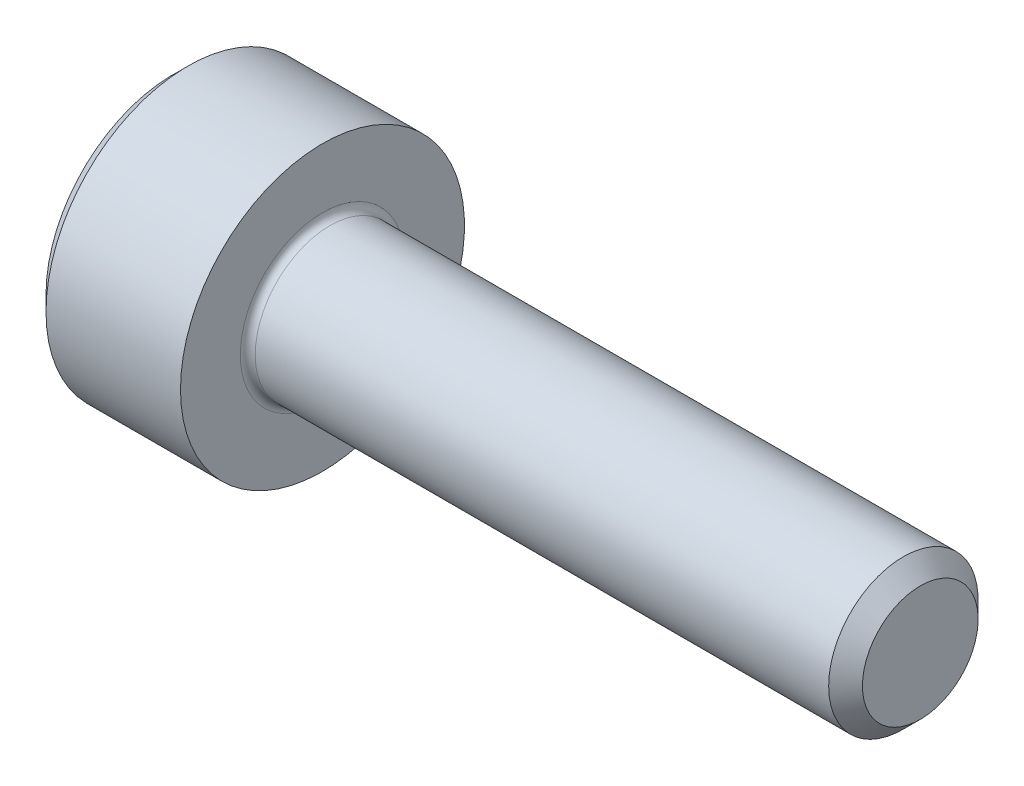
ISO-10303-21;
HEADER;
FILE_DESCRIPTION(('STEP AP214'),'2;1');
FILE_NAME('part.step','',(''),(''),'','','');
FILE_SCHEMA(('AUTOMOTIVE_DESIGN { 1 0 10303 214 1 1 1 1 }'));
ENDSEC;
DATA;
#1=APPLICATION_CONTEXT('core data for automotive mechanical design processes');
#2=APPLICATION_PROTOCOL_DEFINITION('international standard','automotive_design',2000,#1);
#3=PRODUCT_CONTEXT('',#1,'mechanical');
#4=PRODUCT('Part','Part','',(#3));
#5=PRODUCT_RELATED_PRODUCT_CATEGORY('part','',(#4));
#6=PRODUCT_DEFINITION_FORMATION('','',#4);
#7=PRODUCT_DEFINITION_CONTEXT('part definition',#1,'design');
#8=PRODUCT_DEFINITION('design','',#6,#7);
#9=PRODUCT_DEFINITION_SHAPE('','',#8);
#10=(LENGTH_UNIT() NAMED_UNIT(*) SI_UNIT(.MILLI.,.METRE.));
#11=(NAMED_UNIT(*) PLANE_ANGLE_UNIT() SI_UNIT($,.RADIAN.));
#12=(NAMED_UNIT(*) SI_UNIT($,.STERADIAN.) SOLID_ANGLE_UNIT());
#13=UNCERTAINTY_MEASURE_WITH_UNIT(LENGTH_MEASURE(1.E-05),#10,'distance_accuracy_value','');
#14=(GEOMETRIC_REPRESENTATION_CONTEXT(3) GLOBAL_UNCERTAINTY_ASSIGNED_CONTEXT((#13)) GLOBAL_UNIT_ASSIGNED_CONTEXT((#10,
#11,#12)) REPRESENTATION_CONTEXT('',''));
#15=CARTESIAN_POINT('',(0.,0.,0.));
#16=DIRECTION('',(0.,0.,1.));
#17=DIRECTION('',(1.,0.,0.));
#18=AXIS2_PLACEMENT_3D('',#15,#16,#17);
#19=CARTESIAN_POINT('',(0.,0.,0.));
#20=DIRECTION('',(-1.,0.,0.));
#21=DIRECTION('',(0.,0.,1.));
#22=AXIS2_PLACEMENT_3D('',#19,#20,#21);
#23=PLANE('',#22);
#24=DIRECTION('',(0.,-0.499999999999999,0.866025403784439));
#25=VECTOR('',#24,1.);
#26=CARTESIAN_POINT('',(0.,0.892006165897969,0.));
#27=LINE('',#26,#25);
#28=CARTESIAN_POINT('',(0.,0.892006165897969,0.));
#29=VERTEX_POINT('',#28);
#30=CARTESIAN_POINT('',(0.,0.446003082948983,0.772499999999997));
#31=VERTEX_POINT('',#30);
#32=EDGE_CURVE('E261',#29,#31,#27,.T.);
#33=ORIENTED_EDGE('',*,*,#32,.T.);
#34=DIRECTION('',(0.,1.,0.));
#35=VECTOR('',#34,1.);
#36=CARTESIAN_POINT('',(0.,-0.446003082948989,0.772499999999998));
#37=LINE('',#36,#35);
#38=CARTESIAN_POINT('',(0.,-0.446003082948989,0.772499999999998));
#39=VERTEX_POINT('',#38);
#40=EDGE_CURVE('E132',#39,#31,#37,.T.);
#41=ORIENTED_EDGE('',*,*,#40,.F.);
#42=DIRECTION('',(0.,-0.500000000000001,-0.866025403784438));
#43=VECTOR('',#42,1.);
#44=CARTESIAN_POINT('',(0.,-0.446003082948989,0.772499999999998));
#45=LINE('',#44,#43);
#46=CARTESIAN_POINT('',(0.,-0.892006165897975,0.));
#47=VERTEX_POINT('',#46);
#48=EDGE_CURVE('E264',#39,#47,#45,.T.);
#49=ORIENTED_EDGE('',*,*,#48,.T.);
#50=DIRECTION('',(0.,0.499999999999999,-0.866025403784439));
#51=VECTOR('',#50,1.);
#52=CARTESIAN_POINT('',(0.,-0.892006165897975,0.));
#53=LINE('',#52,#51);
#54=CARTESIAN_POINT('',(0.,-0.44600308294899,-0.772500000000001));
#55=VERTEX_POINT('',#54);
#56=EDGE_CURVE('E267',#47,#55,#53,.T.);
#57=ORIENTED_EDGE('',*,*,#56,.T.);
#58=DIRECTION('',(0.,-1.,0.));
#59=VECTOR('',#58,1.);
#60=CARTESIAN_POINT('',(0.,0.446003082948982,-0.772500000000003));
#61=LINE('',#60,#59);
#62=CARTESIAN_POINT('',(0.,0.446003082948982,-0.772500000000003));
#63=VERTEX_POINT('',#62);
#64=EDGE_CURVE('E270',#63,#55,#61,.T.);
#65=ORIENTED_EDGE('',*,*,#64,.F.);
#66=DIRECTION('',(0.,-0.500000000000001,-0.866025403784438));
#67=VECTOR('',#66,1.);
#68=CARTESIAN_POINT('',(0.,0.892006165897969,0.));
#69=LINE('',#68,#67);
#70=EDGE_CURVE('E127',#29,#63,#69,.T.);
#71=ORIENTED_EDGE('',*,*,#70,.F.);
#72=EDGE_LOOP('',(#33,#41,#49,#57,#65,#71));
#73=FACE_BOUND('',#72,.T.);
#74=CARTESIAN_POINT('',(0.,0.,0.));
#75=DIRECTION('',(-1.,0.,0.));
#76=DIRECTION('',(0.,0.,1.));
#77=AXIS2_PLACEMENT_3D('',#74,#75,#76);
#78=CIRCLE('',#77,1.7);
#79=CARTESIAN_POINT('',(0.,0.,1.7));
#80=VERTEX_POINT('',#79);
#81=EDGE_CURVE('E156',#80,#80,#78,.T.);
#82=ORIENTED_EDGE('',*,*,#81,.T.);
#83=EDGE_LOOP('',(#82));
#84=FACE_BOUND('',#83,.T.);
#85=ADVANCED_FACE('F36',(#73,#84),#23,.T.);
#86=CARTESIAN_POINT('',(0.,0.,0.));
#87=DIRECTION('',(1.,0.,0.));
#88=DIRECTION('',(0.,0.,-1.));
#89=AXIS2_PLACEMENT_3D('',#86,#87,#88);
#90=CONICAL_SURFACE('',#89,1.7,0.785398163397448);
#91=CARTESIAN_POINT('',(0.199999999999999,0.,0.));
#92=DIRECTION('',(-1.,0.,0.));
#93=DIRECTION('',(0.,0.,1.));
#94=AXIS2_PLACEMENT_3D('',#91,#92,#93);
#95=CIRCLE('',#94,1.9);
#96=CARTESIAN_POINT('',(0.199999999999999,0.,1.9));
#97=VERTEX_POINT('',#96);
#98=EDGE_CURVE('E153',#97,#97,#95,.T.);
#99=ORIENTED_EDGE('',*,*,#98,.T.);
#100=EDGE_LOOP('',(#99));
#101=FACE_BOUND('',#100,.T.);
#102=ORIENTED_EDGE('',*,*,#81,.F.);
#103=EDGE_LOOP('',(#102));
#104=FACE_BOUND('',#103,.T.);
#105=ADVANCED_FACE('F177',(#101,#104),#90,.T.);
#106=CARTESIAN_POINT('',(-31.75,0.,0.));
#107=DIRECTION('',(-1.,0.,0.));
#108=DIRECTION('',(0.,0.,1.));
#109=AXIS2_PLACEMENT_3D('',#106,#107,#108);
#110=CYLINDRICAL_SURFACE('',#109,1.9);
#111=CARTESIAN_POINT('',(2.,0.,0.));
#112=DIRECTION('',(-1.,0.,0.));
#113=DIRECTION('',(0.,0.,1.));
#114=AXIS2_PLACEMENT_3D('',#111,#112,#113);
#115=CIRCLE('',#114,1.9);
#116=CARTESIAN_POINT('',(2.,0.,1.9));
#117=VERTEX_POINT('',#116);
#118=EDGE_CURVE('E150',#117,#117,#115,.T.);
#119=ORIENTED_EDGE('',*,*,#118,.T.);
#120=EDGE_LOOP('',(#119));
#121=FACE_BOUND('',#120,.T.);
#122=ORIENTED_EDGE('',*,*,#98,.F.);
#123=EDGE_LOOP('',(#122));
#124=FACE_BOUND('',#123,.T.);
#125=ADVANCED_FACE('F182',(#121,#124),#110,.T.);
#126=CARTESIAN_POINT('',(2.,1.9,0.));
#127=DIRECTION('',(1.,0.,0.));
#128=DIRECTION('',(0.,0.,-1.));
#129=AXIS2_PLACEMENT_3D('',#126,#127,#128);
#130=PLANE('',#129);
#131=CARTESIAN_POINT('',(2.,0.,0.));
#132=DIRECTION('',(1.,0.,0.));
#133=DIRECTION('',(0.,0.,-1.));
#134=AXIS2_PLACEMENT_3D('',#131,#132,#133);
#135=CIRCLE('',#134,1.09999999999999);
#136=CARTESIAN_POINT('',(2.,0.,-1.09999999999999));
#137=VERTEX_POINT('',#136);
#138=EDGE_CURVE('E44',#137,#137,#135,.F.);
#139=ORIENTED_EDGE('',*,*,#138,.T.);
#140=EDGE_LOOP('',(#139));
#141=FACE_BOUND('',#140,.T.);
#142=ORIENTED_EDGE('',*,*,#118,.F.);
#143=EDGE_LOOP('',(#142));
#144=FACE_BOUND('',#143,.T.);
#145=ADVANCED_FACE('F161',(#141,#144),#130,.T.);
#146=CARTESIAN_POINT('',(-31.75,0.,0.));
#147=DIRECTION('',(-1.,0.,0.));
#148=DIRECTION('',(0.,0.,1.));
#149=AXIS2_PLACEMENT_3D('',#146,#147,#148);
#150=CYLINDRICAL_SURFACE('',#149,0.999999999999994);
#151=CARTESIAN_POINT('',(2.1,0.,0.));
#152=DIRECTION('',(1.,0.,0.));
#153=DIRECTION('',(0.,0.,-1.));
#154=AXIS2_PLACEMENT_3D('',#151,#152,#153);
#155=CIRCLE('',#154,0.999999999999994);
#156=CARTESIAN_POINT('',(2.1,0.,-0.999999999999994));
#157=VERTEX_POINT('',#156);
#158=EDGE_CURVE('E11',#157,#157,#155,.T.);
#159=ORIENTED_EDGE('',*,*,#158,.T.);
#160=EDGE_LOOP('',(#159));
#161=FACE_BOUND('',#160,.T.);
#162=CARTESIAN_POINT('',(9.774,0.,0.));
#163=DIRECTION('',(-1.,0.,0.));
#164=DIRECTION('',(0.,0.,1.));
#165=AXIS2_PLACEMENT_3D('',#162,#163,#164);
#166=CIRCLE('',#165,0.999999999999987);
#167=CARTESIAN_POINT('',(9.774,0.,0.999999999999987));
#168=VERTEX_POINT('',#167);
#169=EDGE_CURVE('E147',#168,#168,#166,.T.);
#170=ORIENTED_EDGE('',*,*,#169,.T.);
#171=EDGE_LOOP('',(#170));
#172=FACE_BOUND('',#171,.T.);
#173=ADVANCED_FACE('F192',(#161,#172),#150,.T.);
#174=CARTESIAN_POINT('',(10.,0.,0.));
#175=DIRECTION('',(-1.,0.,0.));
#176=DIRECTION('',(0.,0.,1.));
#177=AXIS2_PLACEMENT_3D('',#174,#175,#176);
#178=CONICAL_SURFACE('',#177,0.774,0.785398163397411);
#179=ORIENTED_EDGE('',*,*,#169,.F.);
#180=EDGE_LOOP('',(#179));
#181=FACE_BOUND('',#180,.T.);
#182=CARTESIAN_POINT('',(10.,0.,0.));
#183=DIRECTION('',(-1.,0.,0.));
#184=DIRECTION('',(0.,0.,1.));
#185=AXIS2_PLACEMENT_3D('',#182,#183,#184);
#186=CIRCLE('',#185,0.774);
#187=CARTESIAN_POINT('',(10.,0.,0.774));
#188=VERTEX_POINT('',#187);
#189=EDGE_CURVE('E143',#188,#188,#186,.T.);
#190=ORIENTED_EDGE('',*,*,#189,.T.);
#191=EDGE_LOOP('',(#190));
#192=FACE_BOUND('',#191,.T.);
#193=ADVANCED_FACE('F172',(#181,#192),#178,.T.);
#194=CARTESIAN_POINT('',(10.,0.774,0.));
#195=DIRECTION('',(1.,0.,0.));
#196=DIRECTION('',(0.,0.,-1.));
#197=AXIS2_PLACEMENT_3D('',#194,#195,#196);
#198=PLANE('',#197);
#199=ORIENTED_EDGE('',*,*,#189,.F.);
#200=EDGE_LOOP('',(#199));
#201=FACE_BOUND('',#200,.T.);
#202=ADVANCED_FACE('F165',(#201),#198,.T.);
#203=CARTESIAN_POINT('',(2.1,0.,0.));
#204=DIRECTION('',(1.,0.,0.));
#205=DIRECTION('',(0.,0.,-1.));
#206=AXIS2_PLACEMENT_3D('',#203,#204,#205);
#207=TOROIDAL_SURFACE('',#206,1.09999999999999,0.1);
#208=ORIENTED_EDGE('',*,*,#158,.F.);
#209=EDGE_LOOP('',(#208));
#210=FACE_BOUND('',#209,.T.);
#211=ORIENTED_EDGE('',*,*,#138,.F.);
#212=EDGE_LOOP('',(#211));
#213=FACE_BOUND('',#212,.T.);
#214=ADVANCED_FACE('F38',(#210,#213),#207,.F.);
#215=CARTESIAN_POINT('',(1.,0.892006165897969,0.));
#216=DIRECTION('',(0.,-0.866025403784439,-0.499999999999999));
#217=DIRECTION('',(0.,0.499999999999999,-0.866025403784439));
#218=AXIS2_PLACEMENT_3D('',#215,#216,#217);
#219=PLANE('',#218);
#220=ORIENTED_EDGE('',*,*,#32,.F.);
#221=DIRECTION('',(-1.,0.,0.));
#222=VECTOR('',#221,1.);
#223=CARTESIAN_POINT('',(1.,0.892006165897969,0.));
#224=LINE('',#223,#222);
#225=CARTESIAN_POINT('',(1.,0.892006165897969,0.));
#226=VERTEX_POINT('',#225);
#227=EDGE_CURVE('E251',#226,#29,#224,.T.);
#228=ORIENTED_EDGE('',*,*,#227,.F.);
#229=DIRECTION('',(0.,-0.499999999999999,0.866025403784439));
#230=VECTOR('',#229,1.);
#231=CARTESIAN_POINT('',(1.,0.892006165897969,0.));
#232=LINE('',#231,#230);
#233=CARTESIAN_POINT('',(1.,0.669004624423476,0.386249999999998));
#234=VERTEX_POINT('',#233);
#235=EDGE_CURVE('E119',#226,#234,#232,.T.);
#236=ORIENTED_EDGE('',*,*,#235,.T.);
#237=CARTESIAN_POINT('',(1.,0.446003082948983,0.772499999999997));
#238=VERTEX_POINT('',#237);
#239=EDGE_CURVE('E110',#234,#238,#232,.T.);
#240=ORIENTED_EDGE('',*,*,#239,.T.);
#241=DIRECTION('',(-1.,0.,0.));
#242=VECTOR('',#241,1.);
#243=CARTESIAN_POINT('',(1.,0.446003082948983,0.772499999999997));
#244=LINE('',#243,#242);
#245=EDGE_CURVE('E124',#238,#31,#244,.T.);
#246=ORIENTED_EDGE('',*,*,#245,.T.);
#247=EDGE_LOOP('',(#220,#228,#236,#240,#246));
#248=FACE_BOUND('',#247,.T.);
#249=ADVANCED_FACE('F123',(#248),#219,.T.);
#250=CARTESIAN_POINT('',(1.,-0.446003082948989,0.772499999999998));
#251=DIRECTION('',(0.,0.,1.));
#252=DIRECTION('',(0.,-1.,0.));
#253=AXIS2_PLACEMENT_3D('',#250,#251,#252);
#254=PLANE('',#253);
#255=ORIENTED_EDGE('',*,*,#40,.T.);
#256=ORIENTED_EDGE('',*,*,#245,.F.);
#257=DIRECTION('',(0.,1.,0.));
#258=VECTOR('',#257,1.);
#259=CARTESIAN_POINT('',(1.,-0.446003082948989,0.772499999999998));
#260=LINE('',#259,#258);
#261=CARTESIAN_POINT('',(1.,0.,0.772499999999998));
#262=VERTEX_POINT('',#261);
#263=EDGE_CURVE('E107',#262,#238,#260,.T.);
#264=ORIENTED_EDGE('',*,*,#263,.F.);
#265=CARTESIAN_POINT('',(1.,-0.446003082948989,0.772499999999998));
#266=VERTEX_POINT('',#265);
#267=EDGE_CURVE('E118',#266,#262,#260,.T.);
#268=ORIENTED_EDGE('',*,*,#267,.F.);
#269=DIRECTION('',(-1.,0.,0.));
#270=VECTOR('',#269,1.);
#271=CARTESIAN_POINT('',(1.,-0.446003082948989,0.772499999999998));
#272=LINE('',#271,#270);
#273=EDGE_CURVE('E134',#266,#39,#272,.T.);
#274=ORIENTED_EDGE('',*,*,#273,.T.);
#275=EDGE_LOOP('',(#255,#256,#264,#268,#274));
#276=FACE_BOUND('',#275,.T.);
#277=ADVANCED_FACE('F129',(#276),#254,.F.);
#278=CARTESIAN_POINT('',(1.,-0.446003082948989,0.772499999999998));
#279=DIRECTION('',(0.,0.866025403784438,-0.500000000000001));
#280=DIRECTION('',(0.,0.500000000000001,0.866025403784438));
#281=AXIS2_PLACEMENT_3D('',#278,#279,#280);
#282=PLANE('',#281);
#283=ORIENTED_EDGE('',*,*,#48,.F.);
#284=ORIENTED_EDGE('',*,*,#273,.F.);
#285=DIRECTION('',(0.,-0.500000000000001,-0.866025403784438));
#286=VECTOR('',#285,1.);
#287=CARTESIAN_POINT('',(1.,-0.446003082948989,0.772499999999998));
#288=LINE('',#287,#286);
#289=CARTESIAN_POINT('',(1.,-0.66900462442348,0.386250000000002));
#290=VERTEX_POINT('',#289);
#291=EDGE_CURVE('E290',#266,#290,#288,.T.);
#292=ORIENTED_EDGE('',*,*,#291,.T.);
#293=CARTESIAN_POINT('',(1.,-0.892006165897975,0.));
#294=VERTEX_POINT('',#293);
#295=EDGE_CURVE('E279',#290,#294,#288,.T.);
#296=ORIENTED_EDGE('',*,*,#295,.T.);
#297=DIRECTION('',(-1.,0.,0.));
#298=VECTOR('',#297,1.);
#299=CARTESIAN_POINT('',(1.,-0.892006165897975,0.));
#300=LINE('',#299,#298);
#301=EDGE_CURVE('E139',#294,#47,#300,.T.);
#302=ORIENTED_EDGE('',*,*,#301,.T.);
#303=EDGE_LOOP('',(#283,#284,#292,#296,#302));
#304=FACE_BOUND('',#303,.T.);
#305=ADVANCED_FACE('F205',(#304),#282,.T.);
#306=CARTESIAN_POINT('',(1.,-0.892006165897975,0.));
#307=DIRECTION('',(0.,0.866025403784439,0.5));
#308=DIRECTION('',(0.,-0.499999999999999,0.866025403784439));
#309=AXIS2_PLACEMENT_3D('',#306,#307,#308);
#310=PLANE('',#309);
#311=ORIENTED_EDGE('',*,*,#56,.F.);
#312=ORIENTED_EDGE('',*,*,#301,.F.);
#313=DIRECTION('',(0.,0.499999999999999,-0.866025403784439));
#314=VECTOR('',#313,1.);
#315=CARTESIAN_POINT('',(1.,-0.892006165897975,0.));
#316=LINE('',#315,#314);
#317=CARTESIAN_POINT('',(1.,-0.669004624423482,-0.386250000000001));
#318=VERTEX_POINT('',#317);
#319=EDGE_CURVE('E257',#294,#318,#316,.T.);
#320=ORIENTED_EDGE('',*,*,#319,.T.);
#321=CARTESIAN_POINT('',(1.,-0.44600308294899,-0.772500000000001));
#322=VERTEX_POINT('',#321);
#323=EDGE_CURVE('E289',#318,#322,#316,.T.);
#324=ORIENTED_EDGE('',*,*,#323,.T.);
#325=DIRECTION('',(-1.,0.,0.));
#326=VECTOR('',#325,1.);
#327=CARTESIAN_POINT('',(1.,-0.44600308294899,-0.772500000000001));
#328=LINE('',#327,#326);
#329=EDGE_CURVE('E250',#322,#55,#328,.T.);
#330=ORIENTED_EDGE('',*,*,#329,.T.);
#331=EDGE_LOOP('',(#311,#312,#320,#324,#330));
#332=FACE_BOUND('',#331,.T.);
#333=ADVANCED_FACE('F208',(#332),#310,.T.);
#334=CARTESIAN_POINT('',(1.,0.446003082948982,-0.772500000000003));
#335=DIRECTION('',(0.,0.,-1.));
#336=DIRECTION('',(0.,1.,0.));
#337=AXIS2_PLACEMENT_3D('',#334,#335,#336);
#338=PLANE('',#337);
#339=ORIENTED_EDGE('',*,*,#64,.T.);
#340=ORIENTED_EDGE('',*,*,#329,.F.);
#341=DIRECTION('',(0.,-1.,0.));
#342=VECTOR('',#341,1.);
#343=CARTESIAN_POINT('',(1.,0.446003082948982,-0.772500000000003));
#344=LINE('',#343,#342);
#345=CARTESIAN_POINT('',(1.,0.,-0.7725));
#346=VERTEX_POINT('',#345);
#347=EDGE_CURVE('E254',#346,#322,#344,.T.);
#348=ORIENTED_EDGE('',*,*,#347,.F.);
#349=CARTESIAN_POINT('',(1.,0.446003082948982,-0.772500000000003));
#350=VERTEX_POINT('',#349);
#351=EDGE_CURVE('E51',#350,#346,#344,.T.);
#352=ORIENTED_EDGE('',*,*,#351,.F.);
#353=DIRECTION('',(-1.,0.,0.));
#354=VECTOR('',#353,1.);
#355=CARTESIAN_POINT('',(1.,0.446003082948982,-0.772500000000003));
#356=LINE('',#355,#354);
#357=EDGE_CURVE('E247',#350,#63,#356,.T.);
#358=ORIENTED_EDGE('',*,*,#357,.T.);
#359=EDGE_LOOP('',(#339,#340,#348,#352,#358));
#360=FACE_BOUND('',#359,.T.);
#361=ADVANCED_FACE('F212',(#360),#338,.F.);
#362=CARTESIAN_POINT('',(1.,0.892006165897969,0.));
#363=DIRECTION('',(0.,0.866025403784438,-0.500000000000001));
#364=DIRECTION('',(0.,0.500000000000001,0.866025403784438));
#365=AXIS2_PLACEMENT_3D('',#362,#363,#364);
#366=PLANE('',#365);
#367=ORIENTED_EDGE('',*,*,#70,.T.);
#368=ORIENTED_EDGE('',*,*,#357,.F.);
#369=DIRECTION('',(0.,-0.500000000000001,-0.866025403784438));
#370=VECTOR('',#369,1.);
#371=CARTESIAN_POINT('',(1.,0.892006165897969,0.));
#372=LINE('',#371,#370);
#373=CARTESIAN_POINT('',(1.,0.669004624423477,-0.38625));
#374=VERTEX_POINT('',#373);
#375=EDGE_CURVE('E237',#374,#350,#372,.T.);
#376=ORIENTED_EDGE('',*,*,#375,.F.);
#377=EDGE_CURVE('E243',#226,#374,#372,.T.);
#378=ORIENTED_EDGE('',*,*,#377,.F.);
#379=ORIENTED_EDGE('',*,*,#227,.T.);
#380=EDGE_LOOP('',(#367,#368,#376,#378,#379));
#381=FACE_BOUND('',#380,.T.);
#382=ADVANCED_FACE('F216',(#381),#366,.F.);
#383=CARTESIAN_POINT('',(1.,0.,1.545));
#384=DIRECTION('',(1.,0.,0.));
#385=DIRECTION('',(0.,0.,-1.));
#386=AXIS2_PLACEMENT_3D('',#383,#384,#385);
#387=PLANE('',#386);
#388=ORIENTED_EDGE('',*,*,#347,.T.);
#389=ORIENTED_EDGE('',*,*,#323,.F.);
#390=CARTESIAN_POINT('',(1.,0.,0.));
#391=DIRECTION('',(-1.,0.,0.));
#392=DIRECTION('',(0.,0.,1.));
#393=AXIS2_PLACEMENT_3D('',#390,#391,#392);
#394=CIRCLE('',#393,0.7725);
#395=EDGE_CURVE('E285',#346,#318,#394,.T.);
#396=ORIENTED_EDGE('',*,*,#395,.F.);
#397=EDGE_LOOP('',(#388,#389,#396));
#398=FACE_BOUND('',#397,.T.);
#399=ADVANCED_FACE('F220',(#398),#387,.F.);
#400=ORIENTED_EDGE('',*,*,#319,.F.);
#401=ORIENTED_EDGE('',*,*,#295,.F.);
#402=EDGE_CURVE('E137',#318,#290,#394,.T.);
#403=ORIENTED_EDGE('',*,*,#402,.F.);
#404=EDGE_LOOP('',(#400,#401,#403));
#405=FACE_BOUND('',#404,.T.);
#406=ADVANCED_FACE('F223',(#405),#387,.F.);
#407=ORIENTED_EDGE('',*,*,#291,.F.);
#408=ORIENTED_EDGE('',*,*,#267,.T.);
#409=EDGE_CURVE('E133',#290,#262,#394,.T.);
#410=ORIENTED_EDGE('',*,*,#409,.F.);
#411=EDGE_LOOP('',(#407,#408,#410));
#412=FACE_BOUND('',#411,.T.);
#413=ADVANCED_FACE('F228',(#412),#387,.F.);
#414=ORIENTED_EDGE('',*,*,#263,.T.);
#415=ORIENTED_EDGE('',*,*,#239,.F.);
#416=EDGE_CURVE('E113',#262,#234,#394,.T.);
#417=ORIENTED_EDGE('',*,*,#416,.F.);
#418=EDGE_LOOP('',(#414,#415,#417));
#419=FACE_BOUND('',#418,.T.);
#420=ADVANCED_FACE('F109',(#419),#387,.F.);
#421=ORIENTED_EDGE('',*,*,#235,.F.);
#422=ORIENTED_EDGE('',*,*,#377,.T.);
#423=EDGE_CURVE('E144',#234,#374,#394,.T.);
#424=ORIENTED_EDGE('',*,*,#423,.F.);
#425=EDGE_LOOP('',(#421,#422,#424));
#426=FACE_BOUND('',#425,.T.);
#427=ADVANCED_FACE('F231',(#426),#387,.F.);
#428=ORIENTED_EDGE('',*,*,#375,.T.);
#429=ORIENTED_EDGE('',*,*,#351,.T.);
#430=EDGE_CURVE('E240',#374,#346,#394,.T.);
#431=ORIENTED_EDGE('',*,*,#430,.F.);
#432=EDGE_LOOP('',(#428,#429,#431));
#433=FACE_BOUND('',#432,.T.);
#434=ADVANCED_FACE('F201',(#433),#387,.F.);
#435=CARTESIAN_POINT('',(1.,0.,0.));
#436=DIRECTION('',(-1.,0.,0.));
#437=DIRECTION('',(0.,0.,1.));
#438=AXIS2_PLACEMENT_3D('',#435,#436,#437);
#439=CONICAL_SURFACE('',#438,0.7725,1.04719755119659);
#440=CARTESIAN_POINT('',(1.446003082949,0.,0.));
#441=VERTEX_POINT('',#440);
#442=VERTEX_LOOP('',#441);
#443=FACE_BOUND('',#442,.T.);
#444=ORIENTED_EDGE('',*,*,#416,.T.);
#445=ORIENTED_EDGE('',*,*,#423,.T.);
#446=ORIENTED_EDGE('',*,*,#430,.T.);
#447=ORIENTED_EDGE('',*,*,#395,.T.);
#448=ORIENTED_EDGE('',*,*,#402,.T.);
#449=ORIENTED_EDGE('',*,*,#409,.T.);
#450=EDGE_LOOP('',(#444,#445,#446,#447,#448,#449));
#451=FACE_BOUND('',#450,.T.);
#452=ADVANCED_FACE('F199',(#443,#451),#439,.F.);
#453=CLOSED_SHELL('',(#85,#105,#125,#145,#173,#193,#202,#214,#249,#277,#305,#333,#361,#382,#399,
#406,#413,#420,#427,#434,#452));
#454=MANIFOLD_SOLID_BREP('B2',#453);
#455=ADVANCED_BREP_SHAPE_REPRESENTATION('',(#18,#454),#14);
#456=SHAPE_DEFINITION_REPRESENTATION(#9,#455);
ENDSEC;
END-ISO-10303-21;
